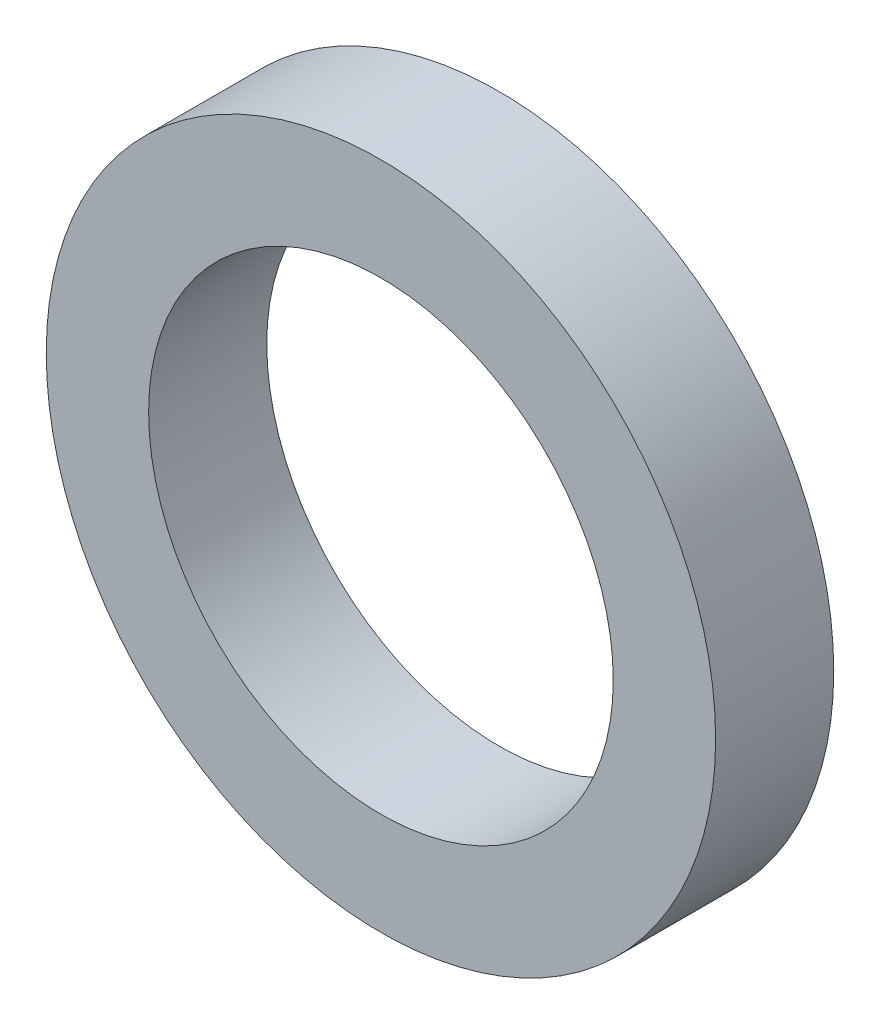
ISO-10303-21;
HEADER;
FILE_DESCRIPTION(('STEP AP214'),'2;1');
FILE_NAME('part.step','',(''),(''),'','','');
FILE_SCHEMA(('AUTOMOTIVE_DESIGN { 1 0 10303 214 1 1 1 1 }'));
ENDSEC;
DATA;
#1=APPLICATION_CONTEXT('core data for automotive mechanical design processes');
#2=APPLICATION_PROTOCOL_DEFINITION('international standard','automotive_design',2000,#1);
#3=PRODUCT_CONTEXT('',#1,'mechanical');
#4=PRODUCT('Part','Part','',(#3));
#5=PRODUCT_RELATED_PRODUCT_CATEGORY('part','',(#4));
#6=PRODUCT_DEFINITION_FORMATION('','',#4);
#7=PRODUCT_DEFINITION_CONTEXT('part definition',#1,'design');
#8=PRODUCT_DEFINITION('design','',#6,#7);
#9=PRODUCT_DEFINITION_SHAPE('','',#8);
#10=(LENGTH_UNIT() NAMED_UNIT(*) SI_UNIT(.MILLI.,.METRE.));
#11=(NAMED_UNIT(*) PLANE_ANGLE_UNIT() SI_UNIT($,.RADIAN.));
#12=(NAMED_UNIT(*) SI_UNIT($,.STERADIAN.) SOLID_ANGLE_UNIT());
#13=UNCERTAINTY_MEASURE_WITH_UNIT(LENGTH_MEASURE(1.E-05),#10,'distance_accuracy_value','');
#14=(GEOMETRIC_REPRESENTATION_CONTEXT(3) GLOBAL_UNCERTAINTY_ASSIGNED_CONTEXT((#13)) GLOBAL_UNIT_ASSIGNED_CONTEXT((#10,
#11,#12)) REPRESENTATION_CONTEXT('',''));
#15=CARTESIAN_POINT('',(0.,0.,0.));
#16=DIRECTION('',(0.,0.,1.));
#17=DIRECTION('',(1.,0.,0.));
#18=AXIS2_PLACEMENT_3D('',#15,#16,#17);
#19=CARTESIAN_POINT('',(0.,0.,-15.));
#20=DIRECTION('',(0.,0.,1.));
#21=DIRECTION('',(1.,0.,0.));
#22=AXIS2_PLACEMENT_3D('',#19,#20,#21);
#23=CYLINDRICAL_SURFACE('',#22,42.5);
#24=CARTESIAN_POINT('',(0.,0.,-15.));
#25=DIRECTION('',(0.,0.,1.));
#26=DIRECTION('',(1.,0.,0.));
#27=AXIS2_PLACEMENT_3D('',#24,#25,#26);
#28=CIRCLE('',#27,42.5);
#29=CARTESIAN_POINT('',(42.5,0.,-15.));
#30=VERTEX_POINT('',#29);
#31=EDGE_CURVE('E10',#30,#30,#28,.T.);
#32=ORIENTED_EDGE('',*,*,#31,.T.);
#33=EDGE_LOOP('',(#32));
#34=FACE_BOUND('',#33,.T.);
#35=CARTESIAN_POINT('',(0.,0.,0.));
#36=DIRECTION('',(0.,0.,1.));
#37=DIRECTION('',(1.,0.,0.));
#38=AXIS2_PLACEMENT_3D('',#35,#36,#37);
#39=CIRCLE('',#38,42.5);
#40=CARTESIAN_POINT('',(42.5,0.,0.));
#41=VERTEX_POINT('',#40);
#42=EDGE_CURVE('E33',#41,#41,#39,.T.);
#43=ORIENTED_EDGE('',*,*,#42,.F.);
#44=EDGE_LOOP('',(#43));
#45=FACE_BOUND('',#44,.T.);
#46=ADVANCED_FACE('F30',(#34,#45),#23,.T.);
#47=CARTESIAN_POINT('',(0.,0.,-15.));
#48=DIRECTION('',(0.,0.,1.));
#49=DIRECTION('',(1.,0.,0.));
#50=AXIS2_PLACEMENT_3D('',#47,#48,#49);
#51=PLANE('',#50);
#52=CARTESIAN_POINT('',(0.,0.,-15.));
#53=DIRECTION('',(0.,0.,1.));
#54=DIRECTION('',(1.,0.,0.));
#55=AXIS2_PLACEMENT_3D('',#52,#53,#54);
#56=CIRCLE('',#55,29.5);
#57=CARTESIAN_POINT('',(29.5,0.,-15.));
#58=VERTEX_POINT('',#57);
#59=EDGE_CURVE('E40',#58,#58,#56,.T.);
#60=ORIENTED_EDGE('',*,*,#59,.T.);
#61=EDGE_LOOP('',(#60));
#62=FACE_BOUND('',#61,.T.);
#63=ORIENTED_EDGE('',*,*,#31,.F.);
#64=EDGE_LOOP('',(#63));
#65=FACE_BOUND('',#64,.T.);
#66=ADVANCED_FACE('F48',(#62,#65),#51,.F.);
#67=CARTESIAN_POINT('',(0.,0.,0.));
#68=DIRECTION('',(0.,0.,1.));
#69=DIRECTION('',(1.,0.,0.));
#70=AXIS2_PLACEMENT_3D('',#67,#68,#69);
#71=PLANE('',#70);
#72=CARTESIAN_POINT('',(0.,0.,0.));
#73=DIRECTION('',(0.,0.,1.));
#74=DIRECTION('',(1.,0.,0.));
#75=AXIS2_PLACEMENT_3D('',#72,#73,#74);
#76=CIRCLE('',#75,29.5);
#77=CARTESIAN_POINT('',(29.5,0.,0.));
#78=VERTEX_POINT('',#77);
#79=EDGE_CURVE('E42',#78,#78,#76,.T.);
#80=ORIENTED_EDGE('',*,*,#79,.F.);
#81=EDGE_LOOP('',(#80));
#82=FACE_BOUND('',#81,.T.);
#83=ORIENTED_EDGE('',*,*,#42,.T.);
#84=EDGE_LOOP('',(#83));
#85=FACE_BOUND('',#84,.T.);
#86=ADVANCED_FACE('F54',(#82,#85),#71,.T.);
#87=CARTESIAN_POINT('',(0.,0.,-15.));
#88=DIRECTION('',(0.,0.,1.));
#89=DIRECTION('',(1.,0.,0.));
#90=AXIS2_PLACEMENT_3D('',#87,#88,#89);
#91=CYLINDRICAL_SURFACE('',#90,29.5);
#92=ORIENTED_EDGE('',*,*,#59,.F.);
#93=EDGE_LOOP('',(#92));
#94=FACE_BOUND('',#93,.T.);
#95=ORIENTED_EDGE('',*,*,#79,.T.);
#96=EDGE_LOOP('',(#95));
#97=FACE_BOUND('',#96,.T.);
#98=ADVANCED_FACE('F51',(#94,#97),#91,.F.);
#99=CLOSED_SHELL('',(#46,#66,#86,#98));
#100=MANIFOLD_SOLID_BREP('B2',#99);
#101=ADVANCED_BREP_SHAPE_REPRESENTATION('',(#18,#100),#14);
#102=SHAPE_DEFINITION_REPRESENTATION(#9,#101);
ENDSEC;
END-ISO-10303-21;
